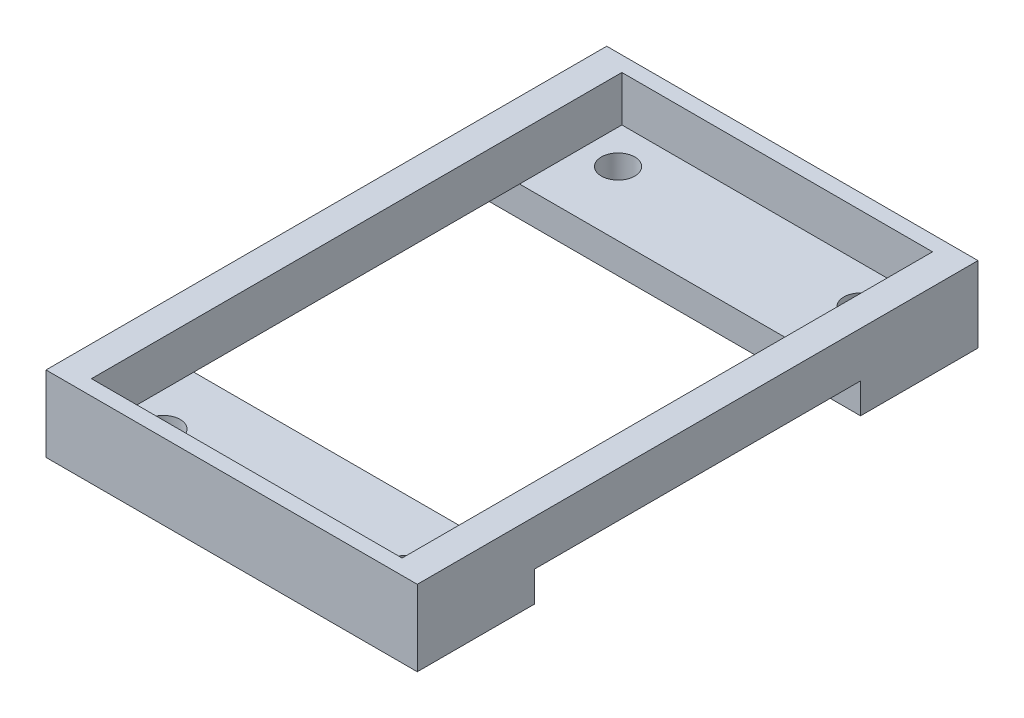
ISO-10303-21;
HEADER;
FILE_DESCRIPTION(('STEP AP214'),'2;1');
FILE_NAME('part.step','',(''),(''),'','','');
FILE_SCHEMA(('AUTOMOTIVE_DESIGN { 1 0 10303 214 1 1 1 1 }'));
ENDSEC;
DATA;
#1=APPLICATION_CONTEXT('core data for automotive mechanical design processes');
#2=APPLICATION_PROTOCOL_DEFINITION('international standard','automotive_design',2000,#1);
#3=PRODUCT_CONTEXT('',#1,'mechanical');
#4=PRODUCT('Part','Part','',(#3));
#5=PRODUCT_RELATED_PRODUCT_CATEGORY('part','',(#4));
#6=PRODUCT_DEFINITION_FORMATION('','',#4);
#7=PRODUCT_DEFINITION_CONTEXT('part definition',#1,'design');
#8=PRODUCT_DEFINITION('design','',#6,#7);
#9=PRODUCT_DEFINITION_SHAPE('','',#8);
#10=(LENGTH_UNIT() NAMED_UNIT(*) SI_UNIT(.MILLI.,.METRE.));
#11=(NAMED_UNIT(*) PLANE_ANGLE_UNIT() SI_UNIT($,.RADIAN.));
#12=(NAMED_UNIT(*) SI_UNIT($,.STERADIAN.) SOLID_ANGLE_UNIT());
#13=UNCERTAINTY_MEASURE_WITH_UNIT(LENGTH_MEASURE(1.E-05),#10,'distance_accuracy_value','');
#14=(GEOMETRIC_REPRESENTATION_CONTEXT(3) GLOBAL_UNCERTAINTY_ASSIGNED_CONTEXT((#13)) GLOBAL_UNIT_ASSIGNED_CONTEXT((#10,
#11,#12)) REPRESENTATION_CONTEXT('',''));
#15=CARTESIAN_POINT('',(0.,0.,0.));
#16=DIRECTION('',(0.,0.,1.));
#17=DIRECTION('',(1.,0.,0.));
#18=AXIS2_PLACEMENT_3D('',#15,#16,#17);
#19=CARTESIAN_POINT('',(0.,2.,0.));
#20=DIRECTION('',(0.,1.,0.));
#21=DIRECTION('',(0.,0.,1.));
#22=AXIS2_PLACEMENT_3D('',#19,#20,#21);
#23=PLANE('',#22);
#24=DIRECTION('',(1.,0.,0.));
#25=VECTOR('',#24,1.);
#26=CARTESIAN_POINT('',(12.25,2.,-10.75));
#27=LINE('',#26,#25);
#28=CARTESIAN_POINT('',(-10.25,2.,-10.75));
#29=VERTEX_POINT('',#28);
#30=CARTESIAN_POINT('',(10.25,2.,-10.75));
#31=VERTEX_POINT('',#30);
#32=EDGE_CURVE('E158',#29,#31,#27,.T.);
#33=ORIENTED_EDGE('',*,*,#32,.T.);
#34=DIRECTION('',(0.,0.,-1.));
#35=VECTOR('',#34,1.);
#36=CARTESIAN_POINT('',(10.25,2.,-17.5));
#37=LINE('',#36,#35);
#38=CARTESIAN_POINT('',(10.25,2.,-17.5));
#39=VERTEX_POINT('',#38);
#40=EDGE_CURVE('E295',#31,#39,#37,.T.);
#41=ORIENTED_EDGE('',*,*,#40,.T.);
#42=DIRECTION('',(-1.,0.,0.));
#43=VECTOR('',#42,1.);
#44=CARTESIAN_POINT('',(-10.25,2.,-17.5));
#45=LINE('',#44,#43);
#46=CARTESIAN_POINT('',(-10.25,2.,-17.5));
#47=VERTEX_POINT('',#46);
#48=EDGE_CURVE('E300',#39,#47,#45,.T.);
#49=ORIENTED_EDGE('',*,*,#48,.T.);
#50=DIRECTION('',(0.,0.,1.));
#51=VECTOR('',#50,1.);
#52=CARTESIAN_POINT('',(-10.25,2.,-17.5));
#53=LINE('',#52,#51);
#54=EDGE_CURVE('E54',#47,#29,#53,.T.);
#55=ORIENTED_EDGE('',*,*,#54,.T.);
#56=EDGE_LOOP('',(#33,#41,#49,#55));
#57=FACE_BOUND('',#56,.T.);
#58=CARTESIAN_POINT('',(8.,2.,-15.));
#59=DIRECTION('',(0.,1.,0.));
#60=DIRECTION('',(0.,0.,1.));
#61=AXIS2_PLACEMENT_3D('',#58,#59,#60);
#62=CIRCLE('',#61,1.1);
#63=CARTESIAN_POINT('',(8.,2.,-13.9));
#64=VERTEX_POINT('',#63);
#65=EDGE_CURVE('E215',#64,#64,#62,.T.);
#66=ORIENTED_EDGE('',*,*,#65,.F.);
#67=EDGE_LOOP('',(#66));
#68=FACE_BOUND('',#67,.T.);
#69=CARTESIAN_POINT('',(-8.,2.,-15.));
#70=DIRECTION('',(0.,1.,0.));
#71=DIRECTION('',(0.,0.,1.));
#72=AXIS2_PLACEMENT_3D('',#69,#70,#71);
#73=CIRCLE('',#72,1.1);
#74=CARTESIAN_POINT('',(-8.,2.,-13.9));
#75=VERTEX_POINT('',#74);
#76=EDGE_CURVE('E219',#75,#75,#73,.T.);
#77=ORIENTED_EDGE('',*,*,#76,.F.);
#78=EDGE_LOOP('',(#77));
#79=FACE_BOUND('',#78,.T.);
#80=ADVANCED_FACE('F45',(#57,#68,#79),#23,.T.);
#81=CARTESIAN_POINT('',(0.,0.,0.));
#82=DIRECTION('',(0.,1.,0.));
#83=DIRECTION('',(0.,0.,1.));
#84=AXIS2_PLACEMENT_3D('',#81,#82,#83);
#85=PLANE('',#84);
#86=CARTESIAN_POINT('',(8.,0.,-15.));
#87=DIRECTION('',(0.,-1.,0.));
#88=DIRECTION('',(0.,0.,-1.));
#89=AXIS2_PLACEMENT_3D('',#86,#87,#88);
#90=CIRCLE('',#89,1.1);
#91=CARTESIAN_POINT('',(8.,0.,-16.1));
#92=VERTEX_POINT('',#91);
#93=EDGE_CURVE('E197',#92,#92,#90,.T.);
#94=ORIENTED_EDGE('',*,*,#93,.F.);
#95=EDGE_LOOP('',(#94));
#96=FACE_BOUND('',#95,.T.);
#97=CARTESIAN_POINT('',(-8.,0.,-15.));
#98=DIRECTION('',(0.,-1.,0.));
#99=DIRECTION('',(0.,0.,-1.));
#100=AXIS2_PLACEMENT_3D('',#97,#98,#99);
#101=CIRCLE('',#100,1.1);
#102=CARTESIAN_POINT('',(-8.,0.,-16.1));
#103=VERTEX_POINT('',#102);
#104=EDGE_CURVE('E191',#103,#103,#101,.T.);
#105=ORIENTED_EDGE('',*,*,#104,.F.);
#106=EDGE_LOOP('',(#105));
#107=FACE_BOUND('',#106,.T.);
#108=DIRECTION('',(0.,0.,-1.));
#109=VECTOR('',#108,1.);
#110=CARTESIAN_POINT('',(12.25,0.,18.5));
#111=LINE('',#110,#109);
#112=CARTESIAN_POINT('',(12.25,0.,-10.75));
#113=VERTEX_POINT('',#112);
#114=CARTESIAN_POINT('',(12.25,0.,-18.5));
#115=VERTEX_POINT('',#114);
#116=EDGE_CURVE('E251',#113,#115,#111,.T.);
#117=ORIENTED_EDGE('',*,*,#116,.F.);
#118=DIRECTION('',(1.,0.,0.));
#119=VECTOR('',#118,1.);
#120=CARTESIAN_POINT('',(12.25,0.,-10.75));
#121=LINE('',#120,#119);
#122=CARTESIAN_POINT('',(-12.25,0.,-10.75));
#123=VERTEX_POINT('',#122);
#124=EDGE_CURVE('E165',#123,#113,#121,.T.);
#125=ORIENTED_EDGE('',*,*,#124,.F.);
#126=DIRECTION('',(0.,0.,1.));
#127=VECTOR('',#126,1.);
#128=CARTESIAN_POINT('',(-12.25,0.,18.5));
#129=LINE('',#128,#127);
#130=CARTESIAN_POINT('',(-12.25,0.,-18.5));
#131=VERTEX_POINT('',#130);
#132=EDGE_CURVE('E274',#131,#123,#129,.T.);
#133=ORIENTED_EDGE('',*,*,#132,.F.);
#134=DIRECTION('',(-1.,0.,0.));
#135=VECTOR('',#134,1.);
#136=CARTESIAN_POINT('',(-12.25,0.,-18.5));
#137=LINE('',#136,#135);
#138=EDGE_CURVE('E270',#115,#131,#137,.T.);
#139=ORIENTED_EDGE('',*,*,#138,.F.);
#140=EDGE_LOOP('',(#117,#125,#133,#139));
#141=FACE_BOUND('',#140,.T.);
#142=ADVANCED_FACE('F354',(#96,#107,#141),#85,.F.);
#143=DIRECTION('',(-1.,0.,0.));
#144=VECTOR('',#143,1.);
#145=CARTESIAN_POINT('',(-12.25,2.,10.75));
#146=LINE('',#145,#144);
#147=CARTESIAN_POINT('',(10.25,2.,10.75));
#148=VERTEX_POINT('',#147);
#149=CARTESIAN_POINT('',(-10.25,2.,10.75));
#150=VERTEX_POINT('',#149);
#151=EDGE_CURVE('E316',#148,#150,#146,.T.);
#152=ORIENTED_EDGE('',*,*,#151,.T.);
#153=CARTESIAN_POINT('',(-10.25,2.,17.5));
#154=VERTEX_POINT('',#153);
#155=EDGE_CURVE('E303',#150,#154,#53,.T.);
#156=ORIENTED_EDGE('',*,*,#155,.T.);
#157=DIRECTION('',(1.,0.,0.));
#158=VECTOR('',#157,1.);
#159=CARTESIAN_POINT('',(-10.25,2.,17.5));
#160=LINE('',#159,#158);
#161=CARTESIAN_POINT('',(10.25,2.,17.5));
#162=VERTEX_POINT('',#161);
#163=EDGE_CURVE('E11',#154,#162,#160,.T.);
#164=ORIENTED_EDGE('',*,*,#163,.T.);
#165=EDGE_CURVE('E296',#162,#148,#37,.T.);
#166=ORIENTED_EDGE('',*,*,#165,.T.);
#167=EDGE_LOOP('',(#152,#156,#164,#166));
#168=FACE_BOUND('',#167,.T.);
#169=CARTESIAN_POINT('',(8.,2.,15.));
#170=DIRECTION('',(0.,1.,0.));
#171=DIRECTION('',(0.,0.,1.));
#172=AXIS2_PLACEMENT_3D('',#169,#170,#171);
#173=CIRCLE('',#172,1.1);
#174=CARTESIAN_POINT('',(8.,2.,16.1));
#175=VERTEX_POINT('',#174);
#176=EDGE_CURVE('E211',#175,#175,#173,.T.);
#177=ORIENTED_EDGE('',*,*,#176,.F.);
#178=EDGE_LOOP('',(#177));
#179=FACE_BOUND('',#178,.T.);
#180=CARTESIAN_POINT('',(-8.,2.,15.));
#181=DIRECTION('',(0.,1.,0.));
#182=DIRECTION('',(0.,0.,1.));
#183=AXIS2_PLACEMENT_3D('',#180,#181,#182);
#184=CIRCLE('',#183,1.1);
#185=CARTESIAN_POINT('',(-8.,2.,16.1));
#186=VERTEX_POINT('',#185);
#187=EDGE_CURVE('E207',#186,#186,#184,.T.);
#188=ORIENTED_EDGE('',*,*,#187,.F.);
#189=EDGE_LOOP('',(#188));
#190=FACE_BOUND('',#189,.T.);
#191=ADVANCED_FACE('F314',(#168,#179,#190),#23,.T.);
#192=CARTESIAN_POINT('',(0.,5.,0.));
#193=DIRECTION('',(0.,-1.,0.));
#194=DIRECTION('',(0.,0.,-1.));
#195=AXIS2_PLACEMENT_3D('',#192,#193,#194);
#196=PLANE('',#195);
#197=DIRECTION('',(0.,0.,-1.));
#198=VECTOR('',#197,1.);
#199=CARTESIAN_POINT('',(12.25,5.,18.5));
#200=LINE('',#199,#198);
#201=CARTESIAN_POINT('',(12.25,5.,18.5));
#202=VERTEX_POINT('',#201);
#203=CARTESIAN_POINT('',(12.25,5.,-18.5));
#204=VERTEX_POINT('',#203);
#205=EDGE_CURVE('E252',#202,#204,#200,.T.);
#206=ORIENTED_EDGE('',*,*,#205,.T.);
#207=DIRECTION('',(-1.,0.,0.));
#208=VECTOR('',#207,1.);
#209=CARTESIAN_POINT('',(-12.25,5.,-18.5));
#210=LINE('',#209,#208);
#211=CARTESIAN_POINT('',(-12.25,5.,-18.5));
#212=VERTEX_POINT('',#211);
#213=EDGE_CURVE('E256',#204,#212,#210,.T.);
#214=ORIENTED_EDGE('',*,*,#213,.T.);
#215=DIRECTION('',(0.,0.,1.));
#216=VECTOR('',#215,1.);
#217=CARTESIAN_POINT('',(-12.25,5.,18.5));
#218=LINE('',#217,#216);
#219=CARTESIAN_POINT('',(-12.25,5.,18.5));
#220=VERTEX_POINT('',#219);
#221=EDGE_CURVE('E260',#212,#220,#218,.T.);
#222=ORIENTED_EDGE('',*,*,#221,.T.);
#223=DIRECTION('',(1.,0.,0.));
#224=VECTOR('',#223,1.);
#225=CARTESIAN_POINT('',(-12.25,5.,18.5));
#226=LINE('',#225,#224);
#227=EDGE_CURVE('E263',#220,#202,#226,.T.);
#228=ORIENTED_EDGE('',*,*,#227,.T.);
#229=EDGE_LOOP('',(#206,#214,#222,#228));
#230=FACE_BOUND('',#229,.T.);
#231=DIRECTION('',(0.,0.,-1.));
#232=VECTOR('',#231,1.);
#233=CARTESIAN_POINT('',(10.25,5.,-17.5));
#234=LINE('',#233,#232);
#235=CARTESIAN_POINT('',(10.25,5.,17.5));
#236=VERTEX_POINT('',#235);
#237=CARTESIAN_POINT('',(10.25,5.,-17.5));
#238=VERTEX_POINT('',#237);
#239=EDGE_CURVE('E223',#236,#238,#234,.T.);
#240=ORIENTED_EDGE('',*,*,#239,.F.);
#241=DIRECTION('',(1.,0.,0.));
#242=VECTOR('',#241,1.);
#243=CARTESIAN_POINT('',(-10.25,5.,17.5));
#244=LINE('',#243,#242);
#245=CARTESIAN_POINT('',(-10.25,5.,17.5));
#246=VERTEX_POINT('',#245);
#247=EDGE_CURVE('E233',#246,#236,#244,.T.);
#248=ORIENTED_EDGE('',*,*,#247,.F.);
#249=DIRECTION('',(0.,0.,1.));
#250=VECTOR('',#249,1.);
#251=CARTESIAN_POINT('',(-10.25,5.,-17.5));
#252=LINE('',#251,#250);
#253=CARTESIAN_POINT('',(-10.25,5.,-17.5));
#254=VERTEX_POINT('',#253);
#255=EDGE_CURVE('E229',#254,#246,#252,.T.);
#256=ORIENTED_EDGE('',*,*,#255,.F.);
#257=DIRECTION('',(-1.,0.,0.));
#258=VECTOR('',#257,1.);
#259=CARTESIAN_POINT('',(-10.25,5.,-17.5));
#260=LINE('',#259,#258);
#261=EDGE_CURVE('E226',#238,#254,#260,.T.);
#262=ORIENTED_EDGE('',*,*,#261,.F.);
#263=EDGE_LOOP('',(#240,#248,#256,#262));
#264=FACE_BOUND('',#263,.T.);
#265=ADVANCED_FACE('F330',(#230,#264),#196,.F.);
#266=CARTESIAN_POINT('',(12.25,5.,18.5));
#267=DIRECTION('',(-1.,0.,0.));
#268=DIRECTION('',(0.,0.,1.));
#269=AXIS2_PLACEMENT_3D('',#266,#267,#268);
#270=PLANE('',#269);
#271=DIRECTION('',(0.,0.,1.));
#272=VECTOR('',#271,1.);
#273=CARTESIAN_POINT('',(12.25,2.,10.75));
#274=LINE('',#273,#272);
#275=CARTESIAN_POINT('',(12.25,2.,-10.75));
#276=VERTEX_POINT('',#275);
#277=CARTESIAN_POINT('',(12.25,2.,10.75));
#278=VERTEX_POINT('',#277);
#279=EDGE_CURVE('E152',#276,#278,#274,.T.);
#280=ORIENTED_EDGE('',*,*,#279,.F.);
#281=DIRECTION('',(0.,-1.,0.));
#282=VECTOR('',#281,1.);
#283=CARTESIAN_POINT('',(12.25,34.5960120260132,-10.75));
#284=LINE('',#283,#282);
#285=EDGE_CURVE('E162',#276,#113,#284,.T.);
#286=ORIENTED_EDGE('',*,*,#285,.T.);
#287=ORIENTED_EDGE('',*,*,#116,.T.);
#288=DIRECTION('',(0.,-1.,0.));
#289=VECTOR('',#288,1.);
#290=CARTESIAN_POINT('',(12.25,5.,-18.5));
#291=LINE('',#290,#289);
#292=EDGE_CURVE('E291',#204,#115,#291,.T.);
#293=ORIENTED_EDGE('',*,*,#292,.F.);
#294=ORIENTED_EDGE('',*,*,#205,.F.);
#295=DIRECTION('',(0.,-1.,0.));
#296=VECTOR('',#295,1.);
#297=CARTESIAN_POINT('',(12.25,5.,18.5));
#298=LINE('',#297,#296);
#299=CARTESIAN_POINT('',(12.25,0.,18.5));
#300=VERTEX_POINT('',#299);
#301=EDGE_CURVE('E266',#202,#300,#298,.T.);
#302=ORIENTED_EDGE('',*,*,#301,.T.);
#303=CARTESIAN_POINT('',(12.25,0.,10.75));
#304=VERTEX_POINT('',#303);
#305=EDGE_CURVE('E267',#300,#304,#111,.T.);
#306=ORIENTED_EDGE('',*,*,#305,.T.);
#307=DIRECTION('',(0.,-1.,0.));
#308=VECTOR('',#307,1.);
#309=CARTESIAN_POINT('',(12.25,34.5960120260132,10.75));
#310=LINE('',#309,#308);
#311=EDGE_CURVE('E69',#278,#304,#310,.T.);
#312=ORIENTED_EDGE('',*,*,#311,.F.);
#313=EDGE_LOOP('',(#280,#286,#287,#293,#294,#302,#306,#312));
#314=FACE_BOUND('',#313,.T.);
#315=ADVANCED_FACE('F170',(#314),#270,.F.);
#316=CARTESIAN_POINT('',(-12.25,5.,-18.5));
#317=DIRECTION('',(0.,0.,1.));
#318=DIRECTION('',(1.,0.,0.));
#319=AXIS2_PLACEMENT_3D('',#316,#317,#318);
#320=PLANE('',#319);
#321=ORIENTED_EDGE('',*,*,#138,.T.);
#322=DIRECTION('',(0.,-1.,0.));
#323=VECTOR('',#322,1.);
#324=CARTESIAN_POINT('',(-12.25,5.,-18.5));
#325=LINE('',#324,#323);
#326=EDGE_CURVE('E287',#212,#131,#325,.T.);
#327=ORIENTED_EDGE('',*,*,#326,.F.);
#328=ORIENTED_EDGE('',*,*,#213,.F.);
#329=ORIENTED_EDGE('',*,*,#292,.T.);
#330=EDGE_LOOP('',(#321,#327,#328,#329));
#331=FACE_BOUND('',#330,.T.);
#332=ADVANCED_FACE('F393',(#331),#320,.F.);
#333=CARTESIAN_POINT('',(-12.25,5.,18.5));
#334=DIRECTION('',(1.,0.,0.));
#335=DIRECTION('',(0.,0.,-1.));
#336=AXIS2_PLACEMENT_3D('',#333,#334,#335);
#337=PLANE('',#336);
#338=ORIENTED_EDGE('',*,*,#132,.T.);
#339=DIRECTION('',(0.,-1.,0.));
#340=VECTOR('',#339,1.);
#341=CARTESIAN_POINT('',(-12.25,34.5960120260132,-10.75));
#342=LINE('',#341,#340);
#343=CARTESIAN_POINT('',(-12.25,2.,-10.75));
#344=VERTEX_POINT('',#343);
#345=EDGE_CURVE('E186',#344,#123,#342,.T.);
#346=ORIENTED_EDGE('',*,*,#345,.F.);
#347=DIRECTION('',(0.,0.,-1.));
#348=VECTOR('',#347,1.);
#349=CARTESIAN_POINT('',(-12.25,2.,10.75));
#350=LINE('',#349,#348);
#351=CARTESIAN_POINT('',(-12.25,2.,10.75));
#352=VERTEX_POINT('',#351);
#353=EDGE_CURVE('E184',#352,#344,#350,.T.);
#354=ORIENTED_EDGE('',*,*,#353,.F.);
#355=DIRECTION('',(0.,-1.,0.));
#356=VECTOR('',#355,1.);
#357=CARTESIAN_POINT('',(-12.25,34.5960120260132,10.75));
#358=LINE('',#357,#356);
#359=CARTESIAN_POINT('',(-12.25,0.,10.75));
#360=VERTEX_POINT('',#359);
#361=EDGE_CURVE('E181',#352,#360,#358,.T.);
#362=ORIENTED_EDGE('',*,*,#361,.T.);
#363=CARTESIAN_POINT('',(-12.25,0.,18.5));
#364=VERTEX_POINT('',#363);
#365=EDGE_CURVE('E273',#360,#364,#129,.T.);
#366=ORIENTED_EDGE('',*,*,#365,.T.);
#367=DIRECTION('',(0.,-1.,0.));
#368=VECTOR('',#367,1.);
#369=CARTESIAN_POINT('',(-12.25,5.,18.5));
#370=LINE('',#369,#368);
#371=EDGE_CURVE('E283',#220,#364,#370,.T.);
#372=ORIENTED_EDGE('',*,*,#371,.F.);
#373=ORIENTED_EDGE('',*,*,#221,.F.);
#374=ORIENTED_EDGE('',*,*,#326,.T.);
#375=EDGE_LOOP('',(#338,#346,#354,#362,#366,#372,#373,#374));
#376=FACE_BOUND('',#375,.T.);
#377=ADVANCED_FACE('F351',(#376),#337,.F.);
#378=CARTESIAN_POINT('',(-12.25,5.,18.5));
#379=DIRECTION('',(0.,0.,-1.));
#380=DIRECTION('',(-1.,0.,0.));
#381=AXIS2_PLACEMENT_3D('',#378,#379,#380);
#382=PLANE('',#381);
#383=DIRECTION('',(1.,0.,0.));
#384=VECTOR('',#383,1.);
#385=CARTESIAN_POINT('',(-12.25,0.,18.5));
#386=LINE('',#385,#384);
#387=EDGE_CURVE('E257',#364,#300,#386,.T.);
#388=ORIENTED_EDGE('',*,*,#387,.T.);
#389=ORIENTED_EDGE('',*,*,#301,.F.);
#390=ORIENTED_EDGE('',*,*,#227,.F.);
#391=ORIENTED_EDGE('',*,*,#371,.T.);
#392=EDGE_LOOP('',(#388,#389,#390,#391));
#393=FACE_BOUND('',#392,.T.);
#394=ADVANCED_FACE('F374',(#393),#382,.F.);
#395=CARTESIAN_POINT('',(10.25,5.,-17.5));
#396=DIRECTION('',(-1.,0.,0.));
#397=DIRECTION('',(0.,0.,1.));
#398=AXIS2_PLACEMENT_3D('',#395,#396,#397);
#399=PLANE('',#398);
#400=DIRECTION('',(0.,-1.,0.));
#401=VECTOR('',#400,1.);
#402=CARTESIAN_POINT('',(10.25,5.,-17.5));
#403=LINE('',#402,#401);
#404=EDGE_CURVE('E247',#238,#39,#403,.T.);
#405=ORIENTED_EDGE('',*,*,#404,.T.);
#406=ORIENTED_EDGE('',*,*,#40,.F.);
#407=DIRECTION('',(0.,0.,-1.));
#408=VECTOR('',#407,1.);
#409=CARTESIAN_POINT('',(10.25,2.,-17.5));
#410=LINE('',#409,#408);
#411=EDGE_CURVE('E154',#148,#31,#410,.T.);
#412=ORIENTED_EDGE('',*,*,#411,.F.);
#413=ORIENTED_EDGE('',*,*,#165,.F.);
#414=DIRECTION('',(0.,-1.,0.));
#415=VECTOR('',#414,1.);
#416=CARTESIAN_POINT('',(10.25,5.,17.5));
#417=LINE('',#416,#415);
#418=EDGE_CURVE('E236',#236,#162,#417,.T.);
#419=ORIENTED_EDGE('',*,*,#418,.F.);
#420=ORIENTED_EDGE('',*,*,#239,.T.);
#421=EDGE_LOOP('',(#405,#406,#412,#413,#419,#420));
#422=FACE_BOUND('',#421,.T.);
#423=ADVANCED_FACE('F332',(#422),#399,.T.);
#424=CARTESIAN_POINT('',(-10.25,5.,-17.5));
#425=DIRECTION('',(0.,0.,1.));
#426=DIRECTION('',(1.,0.,0.));
#427=AXIS2_PLACEMENT_3D('',#424,#425,#426);
#428=PLANE('',#427);
#429=DIRECTION('',(0.,-1.,0.));
#430=VECTOR('',#429,1.);
#431=CARTESIAN_POINT('',(-10.25,5.,-17.5));
#432=LINE('',#431,#430);
#433=EDGE_CURVE('E243',#254,#47,#432,.T.);
#434=ORIENTED_EDGE('',*,*,#433,.T.);
#435=ORIENTED_EDGE('',*,*,#48,.F.);
#436=ORIENTED_EDGE('',*,*,#404,.F.);
#437=ORIENTED_EDGE('',*,*,#261,.T.);
#438=EDGE_LOOP('',(#434,#435,#436,#437));
#439=FACE_BOUND('',#438,.T.);
#440=ADVANCED_FACE('F364',(#439),#428,.T.);
#441=CARTESIAN_POINT('',(-10.25,5.,-17.5));
#442=DIRECTION('',(1.,0.,0.));
#443=DIRECTION('',(0.,0.,-1.));
#444=AXIS2_PLACEMENT_3D('',#441,#442,#443);
#445=PLANE('',#444);
#446=DIRECTION('',(0.,-1.,0.));
#447=VECTOR('',#446,1.);
#448=CARTESIAN_POINT('',(-10.25,5.,17.5));
#449=LINE('',#448,#447);
#450=EDGE_CURVE('E239',#246,#154,#449,.T.);
#451=ORIENTED_EDGE('',*,*,#450,.T.);
#452=ORIENTED_EDGE('',*,*,#155,.F.);
#453=EDGE_CURVE('E306',#29,#150,#53,.T.);
#454=ORIENTED_EDGE('',*,*,#453,.F.);
#455=ORIENTED_EDGE('',*,*,#54,.F.);
#456=ORIENTED_EDGE('',*,*,#433,.F.);
#457=ORIENTED_EDGE('',*,*,#255,.T.);
#458=EDGE_LOOP('',(#451,#452,#454,#455,#456,#457));
#459=FACE_BOUND('',#458,.T.);
#460=ADVANCED_FACE('F323',(#459),#445,.T.);
#461=CARTESIAN_POINT('',(-10.25,5.,17.5));
#462=DIRECTION('',(0.,0.,-1.));
#463=DIRECTION('',(-1.,0.,0.));
#464=AXIS2_PLACEMENT_3D('',#461,#462,#463);
#465=PLANE('',#464);
#466=ORIENTED_EDGE('',*,*,#418,.T.);
#467=ORIENTED_EDGE('',*,*,#163,.F.);
#468=ORIENTED_EDGE('',*,*,#450,.F.);
#469=ORIENTED_EDGE('',*,*,#247,.T.);
#470=EDGE_LOOP('',(#466,#467,#468,#469));
#471=FACE_BOUND('',#470,.T.);
#472=ADVANCED_FACE('F320',(#471),#465,.T.);
#473=CARTESIAN_POINT('',(8.,0.,15.));
#474=DIRECTION('',(0.,-1.,0.));
#475=DIRECTION('',(0.,0.,-1.));
#476=AXIS2_PLACEMENT_3D('',#473,#474,#475);
#477=CIRCLE('',#476,1.1);
#478=CARTESIAN_POINT('',(8.,0.,13.9));
#479=VERTEX_POINT('',#478);
#480=EDGE_CURVE('E192',#479,#479,#477,.T.);
#481=ORIENTED_EDGE('',*,*,#480,.F.);
#482=EDGE_LOOP('',(#481));
#483=FACE_BOUND('',#482,.T.);
#484=CARTESIAN_POINT('',(-8.,0.,15.));
#485=DIRECTION('',(0.,-1.,0.));
#486=DIRECTION('',(0.,0.,-1.));
#487=AXIS2_PLACEMENT_3D('',#484,#485,#486);
#488=CIRCLE('',#487,1.1);
#489=CARTESIAN_POINT('',(-8.,0.,13.9));
#490=VERTEX_POINT('',#489);
#491=EDGE_CURVE('E196',#490,#490,#488,.T.);
#492=ORIENTED_EDGE('',*,*,#491,.F.);
#493=EDGE_LOOP('',(#492));
#494=FACE_BOUND('',#493,.T.);
#495=ORIENTED_EDGE('',*,*,#365,.F.);
#496=DIRECTION('',(-1.,0.,0.));
#497=VECTOR('',#496,1.);
#498=CARTESIAN_POINT('',(-12.25,0.,10.75));
#499=LINE('',#498,#497);
#500=EDGE_CURVE('E159',#304,#360,#499,.T.);
#501=ORIENTED_EDGE('',*,*,#500,.F.);
#502=ORIENTED_EDGE('',*,*,#305,.F.);
#503=ORIENTED_EDGE('',*,*,#387,.F.);
#504=EDGE_LOOP('',(#495,#501,#502,#503));
#505=FACE_BOUND('',#504,.T.);
#506=ADVANCED_FACE('F47',(#483,#494,#505),#85,.F.);
#507=CARTESIAN_POINT('',(-8.,5.,15.));
#508=DIRECTION('',(0.,-1.,0.));
#509=DIRECTION('',(0.,0.,-1.));
#510=AXIS2_PLACEMENT_3D('',#507,#508,#509);
#511=CYLINDRICAL_SURFACE('',#510,1.1);
#512=ORIENTED_EDGE('',*,*,#187,.T.);
#513=EDGE_LOOP('',(#512));
#514=FACE_BOUND('',#513,.T.);
#515=ORIENTED_EDGE('',*,*,#491,.T.);
#516=EDGE_LOOP('',(#515));
#517=FACE_BOUND('',#516,.T.);
#518=ADVANCED_FACE('F413',(#514,#517),#511,.F.);
#519=CARTESIAN_POINT('',(8.,5.,15.));
#520=DIRECTION('',(0.,-1.,0.));
#521=DIRECTION('',(0.,0.,-1.));
#522=AXIS2_PLACEMENT_3D('',#519,#520,#521);
#523=CYLINDRICAL_SURFACE('',#522,1.1);
#524=ORIENTED_EDGE('',*,*,#176,.T.);
#525=EDGE_LOOP('',(#524));
#526=FACE_BOUND('',#525,.T.);
#527=ORIENTED_EDGE('',*,*,#480,.T.);
#528=EDGE_LOOP('',(#527));
#529=FACE_BOUND('',#528,.T.);
#530=ADVANCED_FACE('F419',(#526,#529),#523,.F.);
#531=CARTESIAN_POINT('',(8.,5.,-15.));
#532=DIRECTION('',(0.,-1.,0.));
#533=DIRECTION('',(0.,0.,-1.));
#534=AXIS2_PLACEMENT_3D('',#531,#532,#533);
#535=CYLINDRICAL_SURFACE('',#534,1.1);
#536=ORIENTED_EDGE('',*,*,#65,.T.);
#537=EDGE_LOOP('',(#536));
#538=FACE_BOUND('',#537,.T.);
#539=ORIENTED_EDGE('',*,*,#93,.T.);
#540=EDGE_LOOP('',(#539));
#541=FACE_BOUND('',#540,.T.);
#542=ADVANCED_FACE('F429',(#538,#541),#535,.F.);
#543=CARTESIAN_POINT('',(-8.,5.,-15.));
#544=DIRECTION('',(0.,-1.,0.));
#545=DIRECTION('',(0.,0.,-1.));
#546=AXIS2_PLACEMENT_3D('',#543,#544,#545);
#547=CYLINDRICAL_SURFACE('',#546,1.1);
#548=ORIENTED_EDGE('',*,*,#76,.T.);
#549=EDGE_LOOP('',(#548));
#550=FACE_BOUND('',#549,.T.);
#551=ORIENTED_EDGE('',*,*,#104,.T.);
#552=EDGE_LOOP('',(#551));
#553=FACE_BOUND('',#552,.T.);
#554=ADVANCED_FACE('F435',(#550,#553),#547,.F.);
#555=CARTESIAN_POINT('',(0.,2.,0.));
#556=DIRECTION('',(0.,1.,0.));
#557=DIRECTION('',(0.,0.,1.));
#558=AXIS2_PLACEMENT_3D('',#555,#556,#557);
#559=PLANE('',#558);
#560=ORIENTED_EDGE('',*,*,#411,.T.);
#561=EDGE_CURVE('E147',#31,#276,#27,.T.);
#562=ORIENTED_EDGE('',*,*,#561,.T.);
#563=ORIENTED_EDGE('',*,*,#279,.T.);
#564=EDGE_CURVE('E179',#278,#148,#146,.T.);
#565=ORIENTED_EDGE('',*,*,#564,.T.);
#566=EDGE_LOOP('',(#560,#562,#563,#565));
#567=FACE_BOUND('',#566,.T.);
#568=ADVANCED_FACE('F149',(#567),#559,.F.);
#569=ORIENTED_EDGE('',*,*,#453,.T.);
#570=EDGE_CURVE('E175',#150,#352,#146,.T.);
#571=ORIENTED_EDGE('',*,*,#570,.T.);
#572=ORIENTED_EDGE('',*,*,#353,.T.);
#573=EDGE_CURVE('E61',#344,#29,#27,.T.);
#574=ORIENTED_EDGE('',*,*,#573,.T.);
#575=EDGE_LOOP('',(#569,#571,#572,#574));
#576=FACE_BOUND('',#575,.T.);
#577=ADVANCED_FACE('F345',(#576),#559,.F.);
#578=CARTESIAN_POINT('',(12.25,34.5960120260132,-10.75));
#579=DIRECTION('',(0.,0.,-1.));
#580=DIRECTION('',(-1.,0.,0.));
#581=AXIS2_PLACEMENT_3D('',#578,#579,#580);
#582=PLANE('',#581);
#583=ORIENTED_EDGE('',*,*,#345,.T.);
#584=ORIENTED_EDGE('',*,*,#124,.T.);
#585=ORIENTED_EDGE('',*,*,#285,.F.);
#586=ORIENTED_EDGE('',*,*,#561,.F.);
#587=ORIENTED_EDGE('',*,*,#32,.F.);
#588=ORIENTED_EDGE('',*,*,#573,.F.);
#589=EDGE_LOOP('',(#583,#584,#585,#586,#587,#588));
#590=FACE_BOUND('',#589,.T.);
#591=ADVANCED_FACE('F163',(#590),#582,.F.);
#592=CARTESIAN_POINT('',(-12.25,34.5960120260132,10.75));
#593=DIRECTION('',(0.,0.,1.));
#594=DIRECTION('',(1.,0.,0.));
#595=AXIS2_PLACEMENT_3D('',#592,#593,#594);
#596=PLANE('',#595);
#597=ORIENTED_EDGE('',*,*,#311,.T.);
#598=ORIENTED_EDGE('',*,*,#500,.T.);
#599=ORIENTED_EDGE('',*,*,#361,.F.);
#600=ORIENTED_EDGE('',*,*,#570,.F.);
#601=ORIENTED_EDGE('',*,*,#151,.F.);
#602=ORIENTED_EDGE('',*,*,#564,.F.);
#603=EDGE_LOOP('',(#597,#598,#599,#600,#601,#602));
#604=FACE_BOUND('',#603,.T.);
#605=ADVANCED_FACE('F348',(#604),#596,.F.);
#606=CLOSED_SHELL('',(#80,#142,#191,#265,#315,#332,#377,#394,#423,#440,#460,#472,#506,#518,#530,
#542,#554,#568,#577,#591,#605));
#607=MANIFOLD_SOLID_BREP('B2',#606);
#608=ADVANCED_BREP_SHAPE_REPRESENTATION('',(#18,#607),#14);
#609=SHAPE_DEFINITION_REPRESENTATION(#9,#608);
ENDSEC;
END-ISO-10303-21;
